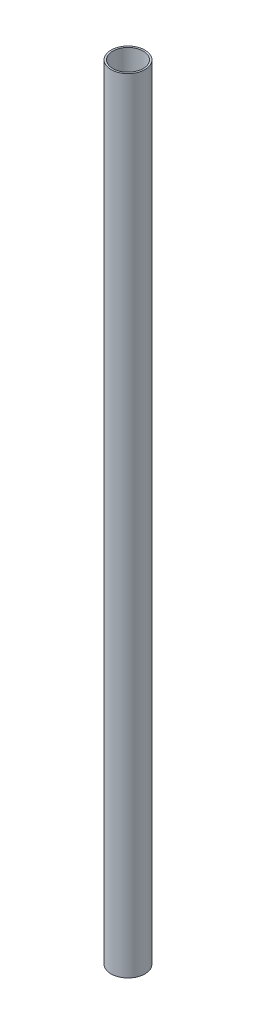
ISO-10303-21;
HEADER;
FILE_DESCRIPTION(('STEP AP214'),'2;1');
FILE_NAME('part.step','',(''),(''),'','','');
FILE_SCHEMA(('AUTOMOTIVE_DESIGN { 1 0 10303 214 1 1 1 1 }'));
ENDSEC;
DATA;
#1=APPLICATION_CONTEXT('core data for automotive mechanical design processes');
#2=APPLICATION_PROTOCOL_DEFINITION('international standard','automotive_design',2000,#1);
#3=PRODUCT_CONTEXT('',#1,'mechanical');
#4=PRODUCT('Part','Part','',(#3));
#5=PRODUCT_RELATED_PRODUCT_CATEGORY('part','',(#4));
#6=PRODUCT_DEFINITION_FORMATION('','',#4);
#7=PRODUCT_DEFINITION_CONTEXT('part definition',#1,'design');
#8=PRODUCT_DEFINITION('design','',#6,#7);
#9=PRODUCT_DEFINITION_SHAPE('','',#8);
#10=(LENGTH_UNIT() NAMED_UNIT(*) SI_UNIT(.MILLI.,.METRE.));
#11=(NAMED_UNIT(*) PLANE_ANGLE_UNIT() SI_UNIT($,.RADIAN.));
#12=(NAMED_UNIT(*) SI_UNIT($,.STERADIAN.) SOLID_ANGLE_UNIT());
#13=UNCERTAINTY_MEASURE_WITH_UNIT(LENGTH_MEASURE(1.E-05),#10,'distance_accuracy_value','');
#14=(GEOMETRIC_REPRESENTATION_CONTEXT(3) GLOBAL_UNCERTAINTY_ASSIGNED_CONTEXT((#13)) GLOBAL_UNIT_ASSIGNED_CONTEXT((#10,
#11,#12)) REPRESENTATION_CONTEXT('',''));
#15=CARTESIAN_POINT('',(0.,0.,0.));
#16=DIRECTION('',(0.,0.,1.));
#17=DIRECTION('',(1.,0.,0.));
#18=AXIS2_PLACEMENT_3D('',#15,#16,#17);
#19=CARTESIAN_POINT('',(0.,183.642,0.));
#20=DIRECTION('',(0.,1.,0.));
#21=DIRECTION('',(0.,0.,1.));
#22=AXIS2_PLACEMENT_3D('',#19,#20,#21);
#23=PLANE('',#22);
#24=CARTESIAN_POINT('',(0.,183.642,0.));
#25=DIRECTION('',(0.,1.,0.));
#26=DIRECTION('',(0.,0.,1.));
#27=AXIS2_PLACEMENT_3D('',#24,#25,#26);
#28=CIRCLE('',#27,3.96875);
#29=CARTESIAN_POINT('',(0.,183.642,3.96875));
#30=VERTEX_POINT('',#29);
#31=EDGE_CURVE('E10',#30,#30,#28,.T.);
#32=ORIENTED_EDGE('',*,*,#31,.T.);
#33=EDGE_LOOP('',(#32));
#34=FACE_BOUND('',#33,.T.);
#35=CARTESIAN_POINT('',(0.,183.642,0.));
#36=DIRECTION('',(0.,1.,0.));
#37=DIRECTION('',(0.,0.,1.));
#38=AXIS2_PLACEMENT_3D('',#35,#36,#37);
#39=CIRCLE('',#38,3.56235);
#40=CARTESIAN_POINT('',(0.,183.642,3.56235));
#41=VERTEX_POINT('',#40);
#42=EDGE_CURVE('E41',#41,#41,#39,.T.);
#43=ORIENTED_EDGE('',*,*,#42,.F.);
#44=EDGE_LOOP('',(#43));
#45=FACE_BOUND('',#44,.T.);
#46=ADVANCED_FACE('F30',(#34,#45),#23,.T.);
#47=CARTESIAN_POINT('',(0.,0.,0.));
#48=DIRECTION('',(0.,1.,0.));
#49=DIRECTION('',(0.,0.,1.));
#50=AXIS2_PLACEMENT_3D('',#47,#48,#49);
#51=PLANE('',#50);
#52=CARTESIAN_POINT('',(0.,0.,0.));
#53=DIRECTION('',(0.,1.,0.));
#54=DIRECTION('',(0.,0.,1.));
#55=AXIS2_PLACEMENT_3D('',#52,#53,#54);
#56=CIRCLE('',#55,3.96875);
#57=CARTESIAN_POINT('',(0.,0.,3.96875));
#58=VERTEX_POINT('',#57);
#59=EDGE_CURVE('E34',#58,#58,#56,.T.);
#60=ORIENTED_EDGE('',*,*,#59,.F.);
#61=EDGE_LOOP('',(#60));
#62=FACE_BOUND('',#61,.T.);
#63=CARTESIAN_POINT('',(0.,0.,0.));
#64=DIRECTION('',(0.,1.,0.));
#65=DIRECTION('',(0.,0.,1.));
#66=AXIS2_PLACEMENT_3D('',#63,#64,#65);
#67=CIRCLE('',#66,3.56235);
#68=CARTESIAN_POINT('',(0.,0.,3.56235));
#69=VERTEX_POINT('',#68);
#70=EDGE_CURVE('E43',#69,#69,#67,.T.);
#71=ORIENTED_EDGE('',*,*,#70,.T.);
#72=EDGE_LOOP('',(#71));
#73=FACE_BOUND('',#72,.T.);
#74=ADVANCED_FACE('F53',(#62,#73),#51,.F.);
#75=CARTESIAN_POINT('',(0.,183.642,0.));
#76=DIRECTION('',(0.,-1.,0.));
#77=DIRECTION('',(0.,0.,-1.));
#78=AXIS2_PLACEMENT_3D('',#75,#76,#77);
#79=CYLINDRICAL_SURFACE('',#78,3.96875);
#80=ORIENTED_EDGE('',*,*,#31,.F.);
#81=EDGE_LOOP('',(#80));
#82=FACE_BOUND('',#81,.T.);
#83=ORIENTED_EDGE('',*,*,#59,.T.);
#84=EDGE_LOOP('',(#83));
#85=FACE_BOUND('',#84,.T.);
#86=ADVANCED_FACE('F32',(#82,#85),#79,.T.);
#87=CARTESIAN_POINT('',(0.,183.642,0.));
#88=DIRECTION('',(0.,-1.,0.));
#89=DIRECTION('',(0.,0.,-1.));
#90=AXIS2_PLACEMENT_3D('',#87,#88,#89);
#91=CYLINDRICAL_SURFACE('',#90,3.56235);
#92=ORIENTED_EDGE('',*,*,#42,.T.);
#93=EDGE_LOOP('',(#92));
#94=FACE_BOUND('',#93,.T.);
#95=ORIENTED_EDGE('',*,*,#70,.F.);
#96=EDGE_LOOP('',(#95));
#97=FACE_BOUND('',#96,.T.);
#98=ADVANCED_FACE('F49',(#94,#97),#91,.F.);
#99=CLOSED_SHELL('',(#46,#74,#86,#98));
#100=MANIFOLD_SOLID_BREP('B2',#99);
#101=ADVANCED_BREP_SHAPE_REPRESENTATION('',(#18,#100),#14);
#102=SHAPE_DEFINITION_REPRESENTATION(#9,#101);
ENDSEC;
END-ISO-10303-21;
